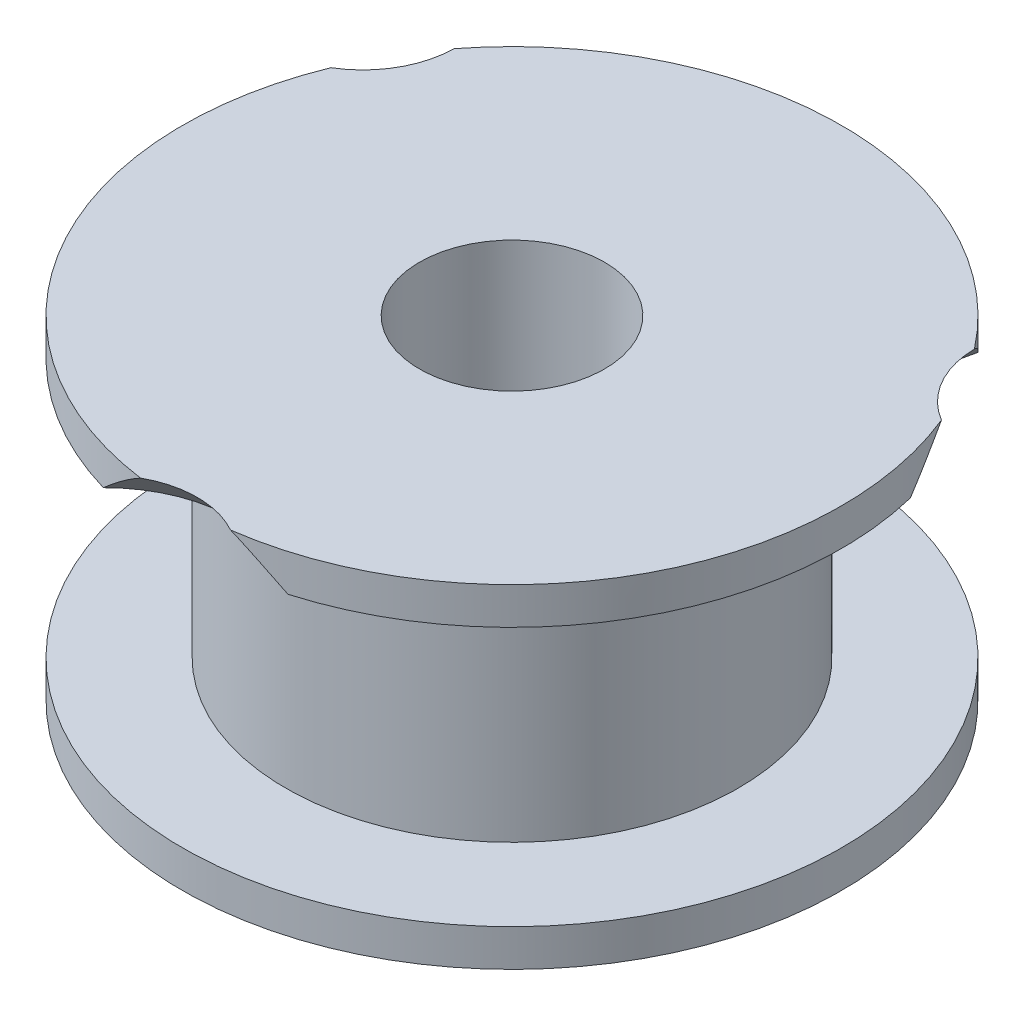
ISO-10303-21;
HEADER;
FILE_DESCRIPTION(('STEP AP214'),'2;1');
FILE_NAME('part.step','',(''),(''),'','','');
FILE_SCHEMA(('AUTOMOTIVE_DESIGN { 1 0 10303 214 1 1 1 1 }'));
ENDSEC;
DATA;
#1=APPLICATION_CONTEXT('core data for automotive mechanical design processes');
#2=APPLICATION_PROTOCOL_DEFINITION('international standard','automotive_design',2000,#1);
#3=PRODUCT_CONTEXT('',#1,'mechanical');
#4=PRODUCT('Part','Part','',(#3));
#5=PRODUCT_RELATED_PRODUCT_CATEGORY('part','',(#4));
#6=PRODUCT_DEFINITION_FORMATION('','',#4);
#7=PRODUCT_DEFINITION_CONTEXT('part definition',#1,'design');
#8=PRODUCT_DEFINITION('design','',#6,#7);
#9=PRODUCT_DEFINITION_SHAPE('','',#8);
#10=(LENGTH_UNIT() NAMED_UNIT(*) SI_UNIT(.MILLI.,.METRE.));
#11=(NAMED_UNIT(*) PLANE_ANGLE_UNIT() SI_UNIT($,.RADIAN.));
#12=(NAMED_UNIT(*) SI_UNIT($,.STERADIAN.) SOLID_ANGLE_UNIT());
#13=UNCERTAINTY_MEASURE_WITH_UNIT(LENGTH_MEASURE(1.E-05),#10,'distance_accuracy_value','');
#14=(GEOMETRIC_REPRESENTATION_CONTEXT(3) GLOBAL_UNCERTAINTY_ASSIGNED_CONTEXT((#13)) GLOBAL_UNIT_ASSIGNED_CONTEXT((#10,
#11,#12)) REPRESENTATION_CONTEXT('',''));
#15=CARTESIAN_POINT('',(0.,0.,0.));
#16=DIRECTION('',(0.,0.,1.));
#17=DIRECTION('',(1.,0.,0.));
#18=AXIS2_PLACEMENT_3D('',#15,#16,#17);
#19=CARTESIAN_POINT('',(0.,0.,0.));
#20=DIRECTION('',(0.,-1.,0.));
#21=DIRECTION('',(0.,0.,-1.));
#22=AXIS2_PLACEMENT_3D('',#19,#20,#21);
#23=CYLINDRICAL_SURFACE('',#22,8.9);
#24=CARTESIAN_POINT('',(0.,9.,0.));
#25=DIRECTION('',(0.,-1.,0.));
#26=DIRECTION('',(0.,0.,-1.));
#27=AXIS2_PLACEMENT_3D('',#24,#25,#26);
#28=CIRCLE('',#27,8.9);
#29=CARTESIAN_POINT('',(-7.02656275779856,9.,-5.46236357364817));
#30=VERTEX_POINT('',#29);
#31=CARTESIAN_POINT('',(7.02656275780027,9.,-5.46236357364596));
#32=VERTEX_POINT('',#31);
#33=EDGE_CURVE('E93',#30,#32,#28,.T.);
#34=ORIENTED_EDGE('',*,*,#33,.T.);
#35=CARTESIAN_POINT('',(7.02656275780027,9.00000000000001,-5.46236357364597));
#36=CARTESIAN_POINT('',(6.99039730709513,8.96451610327831,-5.5088802857902));
#37=CARTESIAN_POINT('',(6.95425946362399,8.92776202845616,-5.55441811257092));
#38=CARTESIAN_POINT('',(6.88199959264417,8.85217703228402,-5.64370384291562));
#39=CARTESIAN_POINT('',(6.84587756560298,8.8133470855634,-5.68745256973273));
#40=CARTESIAN_POINT('',(6.77367207326581,8.73414497280647,-5.77325716735477));
#41=CARTESIAN_POINT('',(6.73758875905482,8.69377716183507,-5.81531721324148));
#42=CARTESIAN_POINT('',(6.66530906723075,8.61170584690801,-5.89802261193783));
#43=CARTESIAN_POINT('',(6.62911267545946,8.57000216910218,-5.93866777916661));
#44=CARTESIAN_POINT('',(6.52034914856027,8.44334994293613,-6.05860575567233));
#45=CARTESIAN_POINT('',(6.44754089143663,8.35678576133796,-6.13598008981275));
#46=CARTESIAN_POINT('',(6.33754205790437,8.22463135351215,-6.24886581958523));
#47=CARTESIAN_POINT('',(6.30069358550924,8.1801325243335,-6.28601389782792));
#48=CARTESIAN_POINT('',(6.22673922487901,8.090509534734,-6.35927879087587));
#49=CARTESIAN_POINT('',(6.18963335088094,8.04538540876311,-6.39539566216134));
#50=CARTESIAN_POINT('',(6.15238292410172,8.,-6.43103291510948));
#51=B_SPLINE_CURVE_WITH_KNOTS('',3,(#35,#36,#37,#38,#39,#40,#41,#42,#43,#44,#45,#46,#47,#48,#49,
#50),.UNSPECIFIED.,.F.,.F.,(4,2,2,2,2,2,2,4),(0.,0.206294088695877,0.412492157943092,
0.618144333111681,0.823823381538566,1.23479951919912,1.44085401925285,1.64689721176685),.UNSPECIFIED.);
#52=CARTESIAN_POINT('',(6.15238292410172,8.,-6.43103291510948));
#53=VERTEX_POINT('',#52);
#54=EDGE_CURVE('E100',#32,#53,#51,.T.);
#55=ORIENTED_EDGE('',*,*,#54,.T.);
#56=CARTESIAN_POINT('',(0.,8.,0.));
#57=DIRECTION('',(0.,-1.,0.));
#58=DIRECTION('',(0.,0.,-1.));
#59=AXIS2_PLACEMENT_3D('',#56,#57,#58);
#60=CIRCLE('',#59,8.9);
#61=CARTESIAN_POINT('',(-6.1523829241002,8.,-6.43103291511094));
#62=VERTEX_POINT('',#61);
#63=EDGE_CURVE('E96',#62,#53,#60,.T.);
#64=ORIENTED_EDGE('',*,*,#63,.F.);
#65=CARTESIAN_POINT('',(-6.1523829241002,8.,-6.43103291511094));
#66=CARTESIAN_POINT('',(-6.18963335087941,8.0453854087631,-6.39539566216282));
#67=CARTESIAN_POINT('',(-6.22673922487747,8.09050953473398,-6.35927879087738));
#68=CARTESIAN_POINT('',(-6.30069358550769,8.18013252433346,-6.28601389782948));
#69=CARTESIAN_POINT('',(-6.33754205790281,8.2246313535121,-6.24886581958681));
#70=CARTESIAN_POINT('',(-6.44754089143505,8.3567857613379,-6.13598008981441));
#71=CARTESIAN_POINT('',(-6.52034914855867,8.44334994293606,-6.05860575567405));
#72=CARTESIAN_POINT('',(-6.62911267545783,8.5700021691021,-5.93866777916842));
#73=CARTESIAN_POINT('',(-6.66530906722912,8.61170584690792,-5.89802261193967));
#74=CARTESIAN_POINT('',(-6.73758875905317,8.69377716183499,-5.81531721324338));
#75=CARTESIAN_POINT('',(-6.77367207326416,8.7341449728064,-5.77325716735671));
#76=CARTESIAN_POINT('',(-6.84587756560131,8.81334708556333,-5.68745256973474));
#77=CARTESIAN_POINT('',(-6.88199959264249,8.85217703228395,-5.64370384291766));
#78=CARTESIAN_POINT('',(-6.95425946362229,8.92776202845612,-5.55441811257305));
#79=CARTESIAN_POINT('',(-6.99039730709342,8.96451610327829,-5.50888028579237));
#80=CARTESIAN_POINT('',(-7.02656275779855,9.00000000000003,-5.4623635736482));
#81=B_SPLINE_CURVE_WITH_KNOTS('',3,(#65,#66,#67,#68,#69,#70,#71,#72,#73,#74,#75,#76,#77,#78,#79,
#80),.UNSPECIFIED.,.F.,.F.,(4,2,2,2,2,2,2,4),(0.,0.206043192513937,0.412097692567591,
0.823073830228013,1.02875287865483,1.23440505382335,1.44060312307049,1.6468972117663),.UNSPECIFIED.);
#82=EDGE_CURVE('E91',#62,#30,#81,.T.);
#83=ORIENTED_EDGE('',*,*,#82,.T.);
#84=EDGE_LOOP('',(#34,#55,#64,#83));
#85=FACE_BOUND('',#84,.T.);
#86=ADVANCED_FACE('F33',(#85),#23,.T.);
#87=CARTESIAN_POINT('',(8.64562933910984,8.,-2.11260344852583));
#88=VERTEX_POINT('',#87);
#89=CARTESIAN_POINT('',(2.49324641500804,8.,8.54363636363636));
#90=VERTEX_POINT('',#89);
#91=EDGE_CURVE('E124',#88,#90,#60,.T.);
#92=ORIENTED_EDGE('',*,*,#91,.F.);
#93=CARTESIAN_POINT('',(8.64562933910984,8.,-2.11260344852583));
#94=CARTESIAN_POINT('',(8.63339178612526,8.0453854087631,-2.16268189089252));
#95=CARTESIAN_POINT('',(8.62066659508588,8.090509534734,-2.2128749560472));
#96=CARTESIAN_POINT('',(8.59419451681594,8.1801325243335,-2.3135537575976));
#97=CARTESIAN_POINT('',(8.58044757355356,8.22463135351214,-2.36403950990378));
#98=CARTESIAN_POINT('',(8.537685080612,8.35678576133796,-2.51574415901562));
#99=CARTESIAN_POINT('',(8.50708107020732,8.44334994293613,-2.61748512636017));
#100=CARTESIAN_POINT('',(8.45759349912448,8.57000216910217,-2.77164609191292));
#101=CARTESIAN_POINT('',(8.44049194764895,8.611705846908,-2.82331567032659));
#102=CARTESIAN_POINT('',(8.40500681725983,8.69377716183507,-2.92726441897212));
#103=CARTESIAN_POINT('',(8.38662340614311,8.73414497280647,-2.97954350867493));
#104=CARTESIAN_POINT('',(8.34841719100951,8.8133470855634,-3.08497759814271));
#105=CARTESIAN_POINT('',(8.32859069572327,8.85217703228401,-3.13813455460513));
#106=CARTESIAN_POINT('',(8.28739692053925,8.92776202845615,-3.24535630372018));
#107=CARTESIAN_POINT('',(8.26602892744959,8.96451610327832,-3.29942150759454));
#108=CARTESIAN_POINT('',(8.24382699838474,9.00000000000004,-3.35400006271661));
#109=B_SPLINE_CURVE_WITH_KNOTS('',3,(#93,#94,#95,#96,#97,#98,#99,#100,#101,#102,#103,#104,#105,
#106,#107,#108),.UNSPECIFIED.,.F.,.F.,(4,2,2,2,2,2,2,4),(0.,0.206043192514006,0.412097692567728,
0.823073830228286,1.02875287865517,1.23440505382376,1.44060312307097,1.64689721176685),.UNSPECIFIED.);
#110=CARTESIAN_POINT('',(8.24382699838472,9.,-3.35400006271664));
#111=VERTEX_POINT('',#110);
#112=EDGE_CURVE('E169',#88,#111,#109,.T.);
#113=ORIENTED_EDGE('',*,*,#112,.T.);
#114=CARTESIAN_POINT('',(1.21726424058417,9.,8.81636363636364));
#115=VERTEX_POINT('',#114);
#116=EDGE_CURVE('E113',#111,#115,#28,.T.);
#117=ORIENTED_EDGE('',*,*,#116,.T.);
#118=CARTESIAN_POINT('',(1.21726424058417,9.,8.81636363636364));
#119=CARTESIAN_POINT('',(1.27563162035418,8.96451610327831,8.80830179338579));
#120=CARTESIAN_POINT('',(1.333137456915,8.92776202845616,8.79977441629216));
#121=CARTESIAN_POINT('',(1.44659110307887,8.85217703228402,8.78183839752179));
#122=CARTESIAN_POINT('',(1.5025396254063,8.81334708556341,8.77243016787649));
#123=CARTESIAN_POINT('',(1.61295133287709,8.73414497280648,8.75280067603075));
#124=CARTESIAN_POINT('',(1.66741805820481,8.69377716183507,8.74258163221464));
#125=CARTESIAN_POINT('',(1.77518288041801,8.61170584690801,8.72133828226547));
#126=CARTESIAN_POINT('',(1.82848082366485,8.57000216910218,8.71031387108058));
#127=CARTESIAN_POINT('',(1.9867319216469,8.44334994293614,8.67609088203355));
#128=CARTESIAN_POINT('',(2.09014418917523,8.35678576133797,8.65172424882941));
#129=CARTESIAN_POINT('',(2.24290551564908,8.22463135351215,8.61290532949005));
#130=CARTESIAN_POINT('',(2.29350093130659,8.1801325243335,8.59956765542658));
#131=CARTESIAN_POINT('',(2.39392737020679,8.090509534734,8.57215374692413));
#132=CARTESIAN_POINT('',(2.44375843524425,8.04538540876311,8.5580775530549));
#133=CARTESIAN_POINT('',(2.49324641500804,8.,8.54363636363636));
#134=B_SPLINE_CURVE_WITH_KNOTS('',3,(#118,#119,#120,#121,#122,#123,#124,#125,#126,#127,#128,
#129,#130,#131,#132,#133),.UNSPECIFIED.,.F.,.F.,(4,2,2,2,2,2,2,4),(0.,0.206294088695885,
0.412492157943106,0.618144333111701,0.82382338153859,1.23479951919916,1.44085401925289,
1.6468972117669),.UNSPECIFIED.);
#135=EDGE_CURVE('E163',#115,#90,#134,.T.);
#136=ORIENTED_EDGE('',*,*,#135,.T.);
#137=EDGE_LOOP('',(#92,#113,#117,#136));
#138=FACE_BOUND('',#137,.T.);
#139=ADVANCED_FACE('F155',(#138),#23,.T.);
#140=CARTESIAN_POINT('',(0.,0.,0.));
#141=DIRECTION('',(0.,-1.,0.));
#142=DIRECTION('',(0.,0.,-1.));
#143=AXIS2_PLACEMENT_3D('',#140,#141,#142);
#144=CYLINDRICAL_SURFACE('',#143,2.5);
#145=CARTESIAN_POINT('',(0.,0.,0.));
#146=DIRECTION('',(0.,-1.,0.));
#147=DIRECTION('',(0.,0.,-1.));
#148=AXIS2_PLACEMENT_3D('',#145,#146,#147);
#149=CIRCLE('',#148,2.5);
#150=CARTESIAN_POINT('',(0.,0.,-2.5));
#151=VERTEX_POINT('',#150);
#152=EDGE_CURVE('E101',#151,#151,#149,.T.);
#153=ORIENTED_EDGE('',*,*,#152,.T.);
#154=EDGE_LOOP('',(#153));
#155=FACE_BOUND('',#154,.T.);
#156=CARTESIAN_POINT('',(0.,9.,0.));
#157=DIRECTION('',(0.,-1.,0.));
#158=DIRECTION('',(0.,0.,-1.));
#159=AXIS2_PLACEMENT_3D('',#156,#157,#158);
#160=CIRCLE('',#159,2.5);
#161=CARTESIAN_POINT('',(0.,9.,-2.5));
#162=VERTEX_POINT('',#161);
#163=EDGE_CURVE('E121',#162,#162,#160,.T.);
#164=ORIENTED_EDGE('',*,*,#163,.F.);
#165=EDGE_LOOP('',(#164));
#166=FACE_BOUND('',#165,.T.);
#167=ADVANCED_FACE('F202',(#155,#166),#144,.F.);
#168=CARTESIAN_POINT('',(2.5,0.,0.));
#169=DIRECTION('',(0.,-1.,0.));
#170=DIRECTION('',(0.,0.,-1.));
#171=AXIS2_PLACEMENT_3D('',#168,#169,#170);
#172=PLANE('',#171);
#173=CARTESIAN_POINT('',(0.,0.,0.));
#174=DIRECTION('',(0.,-1.,0.));
#175=DIRECTION('',(0.,0.,-1.));
#176=AXIS2_PLACEMENT_3D('',#173,#174,#175);
#177=CIRCLE('',#176,8.9);
#178=CARTESIAN_POINT('',(0.,0.,-8.9));
#179=VERTEX_POINT('',#178);
#180=EDGE_CURVE('E136',#179,#179,#177,.T.);
#181=ORIENTED_EDGE('',*,*,#180,.T.);
#182=EDGE_LOOP('',(#181));
#183=FACE_BOUND('',#182,.T.);
#184=ORIENTED_EDGE('',*,*,#152,.F.);
#185=EDGE_LOOP('',(#184));
#186=FACE_BOUND('',#185,.T.);
#187=ADVANCED_FACE('F207',(#183,#186),#172,.T.);
#188=CARTESIAN_POINT('',(0.,0.,0.));
#189=DIRECTION('',(0.,-1.,0.));
#190=DIRECTION('',(0.,0.,-1.));
#191=AXIS2_PLACEMENT_3D('',#188,#189,#190);
#192=CYLINDRICAL_SURFACE('',#191,8.9);
#193=CARTESIAN_POINT('',(0.,1.,0.));
#194=DIRECTION('',(0.,-1.,0.));
#195=DIRECTION('',(0.,0.,-1.));
#196=AXIS2_PLACEMENT_3D('',#193,#194,#195);
#197=CIRCLE('',#196,8.9);
#198=CARTESIAN_POINT('',(0.,1.,-8.9));
#199=VERTEX_POINT('',#198);
#200=EDGE_CURVE('E133',#199,#199,#197,.T.);
#201=ORIENTED_EDGE('',*,*,#200,.T.);
#202=EDGE_LOOP('',(#201));
#203=FACE_BOUND('',#202,.T.);
#204=ORIENTED_EDGE('',*,*,#180,.F.);
#205=EDGE_LOOP('',(#204));
#206=FACE_BOUND('',#205,.T.);
#207=ADVANCED_FACE('F214',(#203,#206),#192,.T.);
#208=CARTESIAN_POINT('',(8.9,1.,0.));
#209=DIRECTION('',(0.,1.,0.));
#210=DIRECTION('',(0.,0.,1.));
#211=AXIS2_PLACEMENT_3D('',#208,#209,#210);
#212=PLANE('',#211);
#213=CARTESIAN_POINT('',(0.,1.,0.));
#214=DIRECTION('',(0.,-1.,0.));
#215=DIRECTION('',(0.,0.,-1.));
#216=AXIS2_PLACEMENT_3D('',#213,#214,#215);
#217=CIRCLE('',#216,6.11);
#218=CARTESIAN_POINT('',(0.,1.,-6.11));
#219=VERTEX_POINT('',#218);
#220=EDGE_CURVE('E130',#219,#219,#217,.T.);
#221=ORIENTED_EDGE('',*,*,#220,.T.);
#222=EDGE_LOOP('',(#221));
#223=FACE_BOUND('',#222,.T.);
#224=ORIENTED_EDGE('',*,*,#200,.F.);
#225=EDGE_LOOP('',(#224));
#226=FACE_BOUND('',#225,.T.);
#227=ADVANCED_FACE('F221',(#223,#226),#212,.T.);
#228=CARTESIAN_POINT('',(0.,0.,0.));
#229=DIRECTION('',(0.,-1.,0.));
#230=DIRECTION('',(0.,0.,-1.));
#231=AXIS2_PLACEMENT_3D('',#228,#229,#230);
#232=CYLINDRICAL_SURFACE('',#231,6.11);
#233=CARTESIAN_POINT('',(0.,8.,0.));
#234=DIRECTION('',(0.,-1.,0.));
#235=DIRECTION('',(0.,0.,-1.));
#236=AXIS2_PLACEMENT_3D('',#233,#234,#235);
#237=CIRCLE('',#236,6.11);
#238=CARTESIAN_POINT('',(0.,8.,-6.11));
#239=VERTEX_POINT('',#238);
#240=EDGE_CURVE('E127',#239,#239,#237,.T.);
#241=ORIENTED_EDGE('',*,*,#240,.T.);
#242=EDGE_LOOP('',(#241));
#243=FACE_BOUND('',#242,.T.);
#244=ORIENTED_EDGE('',*,*,#220,.F.);
#245=EDGE_LOOP('',(#244));
#246=FACE_BOUND('',#245,.T.);
#247=ADVANCED_FACE('F224',(#243,#246),#232,.T.);
#248=CARTESIAN_POINT('',(6.11,8.,0.));
#249=DIRECTION('',(0.,-1.,0.));
#250=DIRECTION('',(0.,0.,-1.));
#251=AXIS2_PLACEMENT_3D('',#248,#249,#250);
#252=PLANE('',#251);
#253=ORIENTED_EDGE('',*,*,#63,.T.);
#254=CARTESIAN_POINT('',(9.52627944162953,8.,-5.49999999999959));
#255=DIRECTION('',(0.,-1.,0.));
#256=DIRECTION('',(0.,0.,-1.));
#257=AXIS2_PLACEMENT_3D('',#254,#255,#256);
#258=CIRCLE('',#257,3.50000000000061);
#259=EDGE_CURVE('E180',#53,#88,#258,.F.);
#260=ORIENTED_EDGE('',*,*,#259,.T.);
#261=ORIENTED_EDGE('',*,*,#91,.T.);
#262=CARTESIAN_POINT('',(0.,8.,11.));
#263=DIRECTION('',(0.,-1.,0.));
#264=DIRECTION('',(0.,0.,-1.));
#265=AXIS2_PLACEMENT_3D('',#262,#263,#264);
#266=CIRCLE('',#265,3.50000000000001);
#267=CARTESIAN_POINT('',(-2.49324641500804,8.,8.54363636363636));
#268=VERTEX_POINT('',#267);
#269=EDGE_CURVE('E59',#90,#268,#266,.F.);
#270=ORIENTED_EDGE('',*,*,#269,.T.);
#271=CARTESIAN_POINT('',(-8.64562933910979,8.,-2.112603448526));
#272=VERTEX_POINT('',#271);
#273=EDGE_CURVE('E125',#268,#272,#60,.T.);
#274=ORIENTED_EDGE('',*,*,#273,.T.);
#275=CARTESIAN_POINT('',(-9.52627944162812,8.,-5.50000000000041));
#276=DIRECTION('',(0.,-1.,0.));
#277=DIRECTION('',(0.,0.,-1.));
#278=AXIS2_PLACEMENT_3D('',#275,#276,#277);
#279=CIRCLE('',#278,3.5000000000009);
#280=EDGE_CURVE('E182',#272,#62,#279,.F.);
#281=ORIENTED_EDGE('',*,*,#280,.T.);
#282=EDGE_LOOP('',(#253,#260,#261,#270,#274,#281));
#283=FACE_BOUND('',#282,.T.);
#284=ORIENTED_EDGE('',*,*,#240,.F.);
#285=EDGE_LOOP('',(#284));
#286=FACE_BOUND('',#285,.T.);
#287=ADVANCED_FACE('F154',(#283,#286),#252,.T.);
#288=ORIENTED_EDGE('',*,*,#273,.F.);
#289=CARTESIAN_POINT('',(-2.49324641500804,8.,8.54363636363636));
#290=CARTESIAN_POINT('',(-2.44375843524425,8.04538540876311,8.5580775530549));
#291=CARTESIAN_POINT('',(-2.39392737020679,8.090509534734,8.57215374692413));
#292=CARTESIAN_POINT('',(-2.29350093130659,8.1801325243335,8.59956765542658));
#293=CARTESIAN_POINT('',(-2.24290551564908,8.22463135351215,8.61290532949006));
#294=CARTESIAN_POINT('',(-2.09014418917523,8.35678576133797,8.65172424882942));
#295=CARTESIAN_POINT('',(-1.9867319216469,8.44334994293614,8.67609088203355));
#296=CARTESIAN_POINT('',(-1.82848082366485,8.57000216910218,8.71031387108058));
#297=CARTESIAN_POINT('',(-1.77518288041802,8.61170584690801,8.72133828226547));
#298=CARTESIAN_POINT('',(-1.66741805820481,8.69377716183507,8.74258163221465));
#299=CARTESIAN_POINT('',(-1.61295133287709,8.73414497280648,8.75280067603075));
#300=CARTESIAN_POINT('',(-1.50253962540631,8.8133470855634,8.77243016787648));
#301=CARTESIAN_POINT('',(-1.44659110307887,8.85217703228401,8.78183839752179));
#302=CARTESIAN_POINT('',(-1.333137456915,8.92776202845616,8.79977441629216));
#303=CARTESIAN_POINT('',(-1.2756316203542,8.96451610327832,8.80830179338579));
#304=CARTESIAN_POINT('',(-1.21726424058421,9.00000000000003,8.81636363636364));
#305=B_SPLINE_CURVE_WITH_KNOTS('',3,(#289,#290,#291,#292,#293,#294,#295,#296,#297,#298,#299,
#300,#301,#302,#303,#304),.UNSPECIFIED.,.F.,.F.,(4,2,2,2,2,2,2,4),(0.,0.206043192514011,
0.412097692567738,0.823073830228307,1.0287528786552,1.23440505382379,1.44060312307101,
1.64689721176689),.UNSPECIFIED.);
#306=CARTESIAN_POINT('',(-1.21726424058417,9.,8.81636363636364));
#307=VERTEX_POINT('',#306);
#308=EDGE_CURVE('E11',#268,#307,#305,.T.);
#309=ORIENTED_EDGE('',*,*,#308,.T.);
#310=CARTESIAN_POINT('',(-8.24382699838491,9.,-3.35400006271617));
#311=VERTEX_POINT('',#310);
#312=EDGE_CURVE('E112',#307,#311,#28,.T.);
#313=ORIENTED_EDGE('',*,*,#312,.T.);
#314=CARTESIAN_POINT('',(-8.24382699838491,9.,-3.35400006271617));
#315=CARTESIAN_POINT('',(-8.26602892744976,8.96451610327829,-3.29942150759412));
#316=CARTESIAN_POINT('',(-8.2873969205394,8.92776202845612,-3.24535630371979));
#317=CARTESIAN_POINT('',(-8.3285906957234,8.85217703228396,-3.1381345546048));
#318=CARTESIAN_POINT('',(-8.34841719100963,8.81334708556333,-3.08497759814241));
#319=CARTESIAN_POINT('',(-8.38662340614319,8.7341449728064,-2.97954350867469));
#320=CARTESIAN_POINT('',(-8.4050068172599,8.69377716183499,-2.92726441897191));
#321=CARTESIAN_POINT('',(-8.44049194764901,8.61170584690793,-2.82331567032643));
#322=CARTESIAN_POINT('',(-8.45759349912453,8.5700021691021,-2.77164609191279));
#323=CARTESIAN_POINT('',(-8.50708107020734,8.44334994293606,-2.61748512636011));
#324=CARTESIAN_POINT('',(-8.537685080612,8.3567857613379,-2.51574415901561));
#325=CARTESIAN_POINT('',(-8.58044757355354,8.2246313535121,-2.36403950990384));
#326=CARTESIAN_POINT('',(-8.59419451681592,8.18013252433346,-2.31355375759768));
#327=CARTESIAN_POINT('',(-8.62066659508585,8.09050953473398,-2.21287495604733));
#328=CARTESIAN_POINT('',(-8.63339178612523,8.0453854087631,-2.16268189089267));
#329=CARTESIAN_POINT('',(-8.6456293391098,8.,-2.112603448526));
#330=B_SPLINE_CURVE_WITH_KNOTS('',3,(#314,#315,#316,#317,#318,#319,#320,#321,#322,#323,#324,
#325,#326,#327,#328,#329),.UNSPECIFIED.,.F.,.F.,(4,2,2,2,2,2,2,4),(0.,0.206294088695809,
0.412492157942953,0.618144333111473,0.82382338153829,1.23479951919871,1.44085401925237,
1.6468972117663),.UNSPECIFIED.);
#331=EDGE_CURVE('E46',#311,#272,#330,.T.);
#332=ORIENTED_EDGE('',*,*,#331,.T.);
#333=EDGE_LOOP('',(#288,#309,#313,#332));
#334=FACE_BOUND('',#333,.T.);
#335=ADVANCED_FACE('F149',(#334),#23,.T.);
#336=CARTESIAN_POINT('',(8.9,9.,0.));
#337=DIRECTION('',(0.,1.,0.));
#338=DIRECTION('',(0.,0.,1.));
#339=AXIS2_PLACEMENT_3D('',#336,#337,#338);
#340=PLANE('',#339);
#341=CARTESIAN_POINT('',(-9.52627944162812,9.,-5.50000000000041));
#342=DIRECTION('',(0.,1.,0.));
#343=DIRECTION('',(0.,0.,1.));
#344=AXIS2_PLACEMENT_3D('',#341,#342,#343);
#345=CIRCLE('',#344,2.50000000000089);
#346=EDGE_CURVE('E108',#30,#311,#345,.F.);
#347=ORIENTED_EDGE('',*,*,#346,.T.);
#348=ORIENTED_EDGE('',*,*,#312,.F.);
#349=CARTESIAN_POINT('',(0.,9.,11.));
#350=DIRECTION('',(0.,1.,0.));
#351=DIRECTION('',(0.,0.,1.));
#352=AXIS2_PLACEMENT_3D('',#349,#350,#351);
#353=CIRCLE('',#352,2.5);
#354=EDGE_CURVE('E116',#307,#115,#353,.F.);
#355=ORIENTED_EDGE('',*,*,#354,.T.);
#356=ORIENTED_EDGE('',*,*,#116,.F.);
#357=CARTESIAN_POINT('',(9.52627944162953,9.,-5.49999999999959));
#358=DIRECTION('',(0.,1.,0.));
#359=DIRECTION('',(0.,0.,1.));
#360=AXIS2_PLACEMENT_3D('',#357,#358,#359);
#361=CIRCLE('',#360,2.50000000000061);
#362=EDGE_CURVE('E111',#111,#32,#361,.F.);
#363=ORIENTED_EDGE('',*,*,#362,.T.);
#364=ORIENTED_EDGE('',*,*,#33,.F.);
#365=EDGE_LOOP('',(#347,#348,#355,#356,#363,#364));
#366=FACE_BOUND('',#365,.T.);
#367=ORIENTED_EDGE('',*,*,#163,.T.);
#368=EDGE_LOOP('',(#367));
#369=FACE_BOUND('',#368,.T.);
#370=ADVANCED_FACE('F105',(#366,#369),#340,.T.);
#371=CARTESIAN_POINT('',(9.52627944162953,9.00000000000001,-5.49999999999959));
#372=DIRECTION('',(0.,-1.,0.));
#373=DIRECTION('',(0.,0.,-1.));
#374=AXIS2_PLACEMENT_3D('',#371,#372,#373);
#375=CONICAL_SURFACE('',#374,2.50000000000061,0.785398163397449);
#376=ORIENTED_EDGE('',*,*,#112,.F.);
#377=ORIENTED_EDGE('',*,*,#259,.F.);
#378=ORIENTED_EDGE('',*,*,#54,.F.);
#379=ORIENTED_EDGE('',*,*,#362,.F.);
#380=EDGE_LOOP('',(#376,#377,#378,#379));
#381=FACE_BOUND('',#380,.T.);
#382=ADVANCED_FACE('F186',(#381),#375,.F.);
#383=CARTESIAN_POINT('',(0.,9.,11.));
#384=DIRECTION('',(0.,-1.,0.));
#385=DIRECTION('',(0.,0.,-1.));
#386=AXIS2_PLACEMENT_3D('',#383,#384,#385);
#387=CONICAL_SURFACE('',#386,2.5,0.785398163397451);
#388=ORIENTED_EDGE('',*,*,#308,.F.);
#389=ORIENTED_EDGE('',*,*,#269,.F.);
#390=ORIENTED_EDGE('',*,*,#135,.F.);
#391=ORIENTED_EDGE('',*,*,#354,.F.);
#392=EDGE_LOOP('',(#388,#389,#390,#391));
#393=FACE_BOUND('',#392,.T.);
#394=ADVANCED_FACE('F188',(#393),#387,.F.);
#395=CARTESIAN_POINT('',(-9.52627944162812,9.,-5.50000000000041));
#396=DIRECTION('',(0.,-1.,0.));
#397=DIRECTION('',(0.,0.,-1.));
#398=AXIS2_PLACEMENT_3D('',#395,#396,#397);
#399=CONICAL_SURFACE('',#398,2.50000000000089,0.785398163397452);
#400=ORIENTED_EDGE('',*,*,#82,.F.);
#401=ORIENTED_EDGE('',*,*,#280,.F.);
#402=ORIENTED_EDGE('',*,*,#331,.F.);
#403=ORIENTED_EDGE('',*,*,#346,.F.);
#404=EDGE_LOOP('',(#400,#401,#402,#403));
#405=FACE_BOUND('',#404,.T.);
#406=ADVANCED_FACE('F35',(#405),#399,.F.);
#407=CLOSED_SHELL('',(#86,#139,#167,#187,#207,#227,#247,#287,#335,#370,#382,#394,#406));
#408=MANIFOLD_SOLID_BREP('B2',#407);
#409=ADVANCED_BREP_SHAPE_REPRESENTATION('',(#18,#408),#14);
#410=SHAPE_DEFINITION_REPRESENTATION(#9,#409);
ENDSEC;
END-ISO-10303-21;
